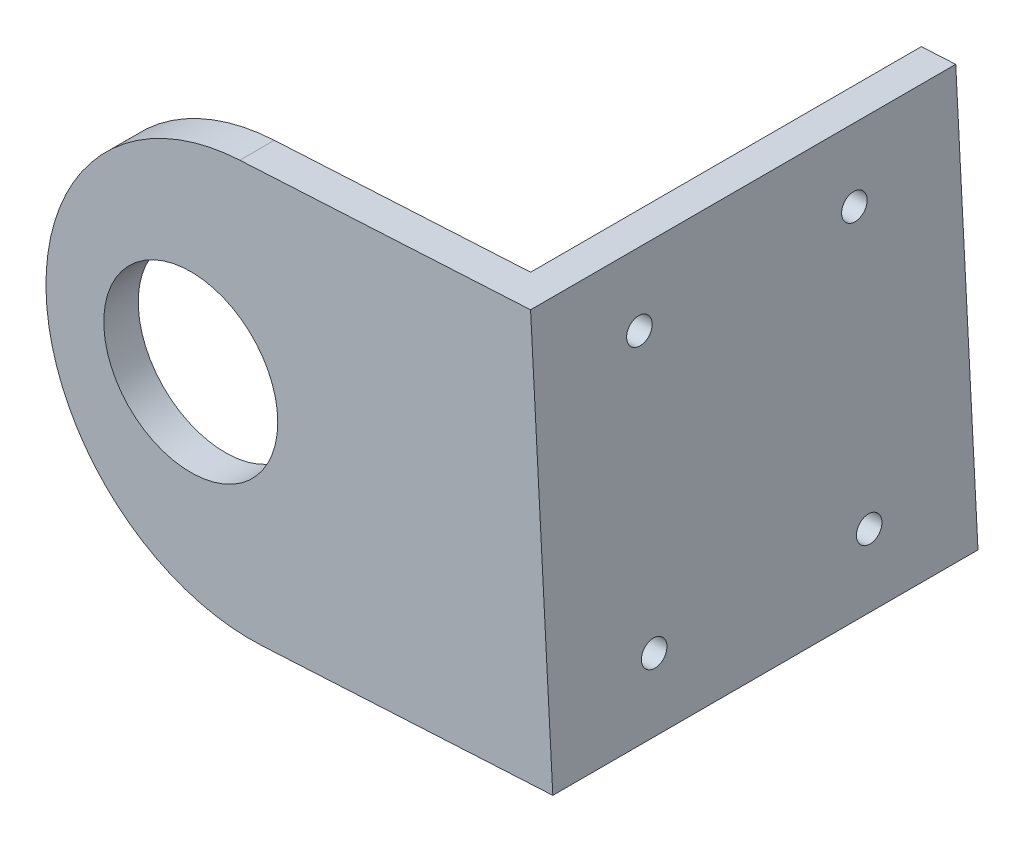
ISO-10303-21;
HEADER;
FILE_DESCRIPTION(('STEP AP214'),'2;1');
FILE_NAME('part.step','',(''),(''),'','','');
FILE_SCHEMA(('AUTOMOTIVE_DESIGN { 1 0 10303 214 1 1 1 1 }'));
ENDSEC;
DATA;
#1=APPLICATION_CONTEXT('core data for automotive mechanical design processes');
#2=APPLICATION_PROTOCOL_DEFINITION('international standard','automotive_design',2000,#1);
#3=PRODUCT_CONTEXT('',#1,'mechanical');
#4=PRODUCT('Part','Part','',(#3));
#5=PRODUCT_RELATED_PRODUCT_CATEGORY('part','',(#4));
#6=PRODUCT_DEFINITION_FORMATION('','',#4);
#7=PRODUCT_DEFINITION_CONTEXT('part definition',#1,'design');
#8=PRODUCT_DEFINITION('design','',#6,#7);
#9=PRODUCT_DEFINITION_SHAPE('','',#8);
#10=(LENGTH_UNIT() NAMED_UNIT(*) SI_UNIT(.MILLI.,.METRE.));
#11=(NAMED_UNIT(*) PLANE_ANGLE_UNIT() SI_UNIT($,.RADIAN.));
#12=(NAMED_UNIT(*) SI_UNIT($,.STERADIAN.) SOLID_ANGLE_UNIT());
#13=UNCERTAINTY_MEASURE_WITH_UNIT(LENGTH_MEASURE(1.E-05),#10,'distance_accuracy_value','');
#14=(GEOMETRIC_REPRESENTATION_CONTEXT(3) GLOBAL_UNCERTAINTY_ASSIGNED_CONTEXT((#13)) GLOBAL_UNIT_ASSIGNED_CONTEXT((#10,
#11,#12)) REPRESENTATION_CONTEXT('',''));
#15=CARTESIAN_POINT('',(0.,0.,0.));
#16=DIRECTION('',(0.,0.,1.));
#17=DIRECTION('',(1.,0.,0.));
#18=AXIS2_PLACEMENT_3D('',#15,#16,#17);
#19=CARTESIAN_POINT('',(8.73708907772197,0.475157287592046,0.));
#20=DIRECTION('',(0.,0.,-1.));
#21=DIRECTION('',(-1.,0.,0.));
#22=AXIS2_PLACEMENT_3D('',#19,#20,#21);
#23=CYLINDRICAL_SURFACE('',#22,29.75);
#24=DIRECTION('',(0.,0.,-1.));
#25=VECTOR('',#24,1.);
#26=CARTESIAN_POINT('',(7.12155429990905,30.1812601518467,5.));
#27=LINE('',#26,#25);
#28=CARTESIAN_POINT('',(7.12155429990905,30.1812601518467,0.));
#29=VERTEX_POINT('',#28);
#30=CARTESIAN_POINT('',(7.12155429990907,30.1812601518467,5.));
#31=VERTEX_POINT('',#30);
#32=EDGE_CURVE('E136',#29,#31,#27,.F.);
#33=ORIENTED_EDGE('',*,*,#32,.F.);
#34=CARTESIAN_POINT('',(8.73708907772197,0.475157287592046,0.));
#35=DIRECTION('',(0.,0.,-1.));
#36=DIRECTION('',(-1.,0.,0.));
#37=AXIS2_PLACEMENT_3D('',#34,#35,#36);
#38=CIRCLE('',#37,29.75);
#39=CARTESIAN_POINT('',(10.3526238555349,-29.2309455766626,0.));
#40=VERTEX_POINT('',#39);
#41=EDGE_CURVE('E43',#40,#29,#38,.T.);
#42=ORIENTED_EDGE('',*,*,#41,.F.);
#43=DIRECTION('',(0.,0.,-1.));
#44=VECTOR('',#43,1.);
#45=CARTESIAN_POINT('',(10.3526238555349,-29.2309455766626,5.));
#46=LINE('',#45,#44);
#47=CARTESIAN_POINT('',(10.3526238555349,-29.2309455766626,5.));
#48=VERTEX_POINT('',#47);
#49=EDGE_CURVE('E149',#48,#40,#46,.T.);
#50=ORIENTED_EDGE('',*,*,#49,.F.);
#51=CARTESIAN_POINT('',(8.73708907772197,0.475157287592046,5.));
#52=DIRECTION('',(0.,0.,-1.));
#53=DIRECTION('',(-1.,0.,0.));
#54=AXIS2_PLACEMENT_3D('',#51,#52,#53);
#55=CIRCLE('',#54,29.75);
#56=EDGE_CURVE('E11',#31,#48,#55,.F.);
#57=ORIENTED_EDGE('',*,*,#56,.F.);
#58=EDGE_LOOP('',(#33,#42,#50,#57));
#59=FACE_BOUND('',#58,.T.);
#60=ADVANCED_FACE('F35',(#59),#23,.T.);
#61=CARTESIAN_POINT('',(0.,0.,5.));
#62=DIRECTION('',(0.,0.,-1.));
#63=DIRECTION('',(-1.,0.,0.));
#64=AXIS2_PLACEMENT_3D('',#61,#62,#63);
#65=PLANE('',#64);
#66=DIRECTION('',(-0.998524466025366,-0.054303690010518,0.));
#67=VECTOR('',#66,1.);
#68=CARTESIAN_POINT('',(-22.5845485643456,28.5657253740338,5.));
#69=LINE('',#68,#67);
#70=CARTESIAN_POINT('',(49.3092129894808,32.4755910547911,5.));
#71=VERTEX_POINT('',#70);
#72=EDGE_CURVE('E91',#71,#31,#69,.T.);
#73=ORIENTED_EDGE('',*,*,#72,.T.);
#74=ORIENTED_EDGE('',*,*,#56,.T.);
#75=DIRECTION('',(0.998524466025366,0.0543036900105184,0.));
#76=VECTOR('',#75,1.);
#77=CARTESIAN_POINT('',(47.5476602149798,-27.2081331237708,5.));
#78=LINE('',#77,#76);
#79=CARTESIAN_POINT('',(52.5402825451066,-26.9366146737182,5.));
#80=VERTEX_POINT('',#79);
#81=EDGE_CURVE('E84',#48,#80,#78,.T.);
#82=ORIENTED_EDGE('',*,*,#81,.T.);
#83=DIRECTION('',(0.0543036900105177,-0.998524466025366,0.));
#84=VECTOR('',#83,1.);
#85=CARTESIAN_POINT('',(52.5402825451066,-26.9366146737182,5.));
#86=LINE('',#85,#84);
#87=EDGE_CURVE('E89',#71,#80,#86,.T.);
#88=ORIENTED_EDGE('',*,*,#87,.F.);
#89=EDGE_LOOP('',(#73,#74,#82,#88));
#90=FACE_BOUND('',#89,.T.);
#91=CARTESIAN_POINT('',(0.,0.,5.));
#92=DIRECTION('',(0.,0.,1.));
#93=DIRECTION('',(1.,0.,0.));
#94=AXIS2_PLACEMENT_3D('',#91,#92,#93);
#95=CIRCLE('',#94,12.625);
#96=CARTESIAN_POINT('',(12.625,0.,5.));
#97=VERTEX_POINT('',#96);
#98=EDGE_CURVE('E128',#97,#97,#95,.T.);
#99=ORIENTED_EDGE('',*,*,#98,.F.);
#100=EDGE_LOOP('',(#99));
#101=FACE_BOUND('',#100,.T.);
#102=ADVANCED_FACE('F86',(#90,#101),#65,.F.);
#103=CARTESIAN_POINT('',(0.,0.,0.));
#104=DIRECTION('',(0.,0.,-1.));
#105=DIRECTION('',(-1.,0.,0.));
#106=AXIS2_PLACEMENT_3D('',#103,#104,#105);
#107=PLANE('',#106);
#108=DIRECTION('',(0.998524466025366,0.0543036900105184,0.));
#109=VECTOR('',#108,1.);
#110=CARTESIAN_POINT('',(47.5476602149798,-27.2081331237708,0.));
#111=LINE('',#110,#109);
#112=CARTESIAN_POINT('',(47.5476602149798,-27.2081331237708,0.));
#113=VERTEX_POINT('',#112);
#114=EDGE_CURVE('E131',#40,#113,#111,.T.);
#115=ORIENTED_EDGE('',*,*,#114,.F.);
#116=ORIENTED_EDGE('',*,*,#41,.T.);
#117=DIRECTION('',(-0.998524466025366,-0.054303690010518,0.));
#118=VECTOR('',#117,1.);
#119=CARTESIAN_POINT('',(-22.5845485643456,28.5657253740338,0.));
#120=LINE('',#119,#118);
#121=CARTESIAN_POINT('',(44.3165906593539,32.2040726047385,0.));
#122=VERTEX_POINT('',#121);
#123=EDGE_CURVE('E92',#122,#29,#120,.T.);
#124=ORIENTED_EDGE('',*,*,#123,.F.);
#125=DIRECTION('',(-0.0543036900105177,0.998524466025366,0.));
#126=VECTOR('',#125,1.);
#127=CARTESIAN_POINT('',(44.3165906593539,32.2040726047385,0.));
#128=LINE('',#127,#126);
#129=EDGE_CURVE('E141',#113,#122,#128,.T.);
#130=ORIENTED_EDGE('',*,*,#129,.F.);
#131=EDGE_LOOP('',(#115,#116,#124,#130));
#132=FACE_BOUND('',#131,.T.);
#133=CARTESIAN_POINT('',(0.,0.,0.));
#134=DIRECTION('',(0.,0.,1.));
#135=DIRECTION('',(1.,0.,0.));
#136=AXIS2_PLACEMENT_3D('',#133,#134,#135);
#137=CIRCLE('',#136,12.625);
#138=CARTESIAN_POINT('',(12.625,0.,0.));
#139=VERTEX_POINT('',#138);
#140=EDGE_CURVE('E132',#139,#139,#137,.T.);
#141=ORIENTED_EDGE('',*,*,#140,.T.);
#142=EDGE_LOOP('',(#141));
#143=FACE_BOUND('',#142,.T.);
#144=ADVANCED_FACE('F152',(#132,#143),#107,.T.);
#145=CARTESIAN_POINT('',(47.5476602149798,-27.2081331237708,5.));
#146=DIRECTION('',(-0.0543036900105184,0.998524466025366,0.));
#147=DIRECTION('',(-0.998524466025366,-0.0543036900105184,0.));
#148=AXIS2_PLACEMENT_3D('',#145,#146,#147);
#149=PLANE('',#148);
#150=ORIENTED_EDGE('',*,*,#81,.F.);
#151=ORIENTED_EDGE('',*,*,#49,.T.);
#152=ORIENTED_EDGE('',*,*,#114,.T.);
#153=DIRECTION('',(0.,0.,-1.));
#154=VECTOR('',#153,1.);
#155=CARTESIAN_POINT('',(47.5476602149798,-27.2081331237708,-56.7));
#156=LINE('',#155,#154);
#157=CARTESIAN_POINT('',(47.5476602149798,-27.2081331237708,-56.7));
#158=VERTEX_POINT('',#157);
#159=EDGE_CURVE('E124',#113,#158,#156,.T.);
#160=ORIENTED_EDGE('',*,*,#159,.T.);
#161=DIRECTION('',(-0.998524466025366,-0.0543036900105177,0.));
#162=VECTOR('',#161,1.);
#163=CARTESIAN_POINT('',(52.5402825451066,-26.9366146737182,-56.7));
#164=LINE('',#163,#162);
#165=CARTESIAN_POINT('',(52.5402825451066,-26.9366146737182,-56.7));
#166=VERTEX_POINT('',#165);
#167=EDGE_CURVE('E98',#166,#158,#164,.T.);
#168=ORIENTED_EDGE('',*,*,#167,.F.);
#169=DIRECTION('',(0.,0.,-1.));
#170=VECTOR('',#169,1.);
#171=CARTESIAN_POINT('',(52.5402825451066,-26.9366146737182,-56.7));
#172=LINE('',#171,#170);
#173=EDGE_CURVE('E95',#80,#166,#172,.T.);
#174=ORIENTED_EDGE('',*,*,#173,.F.);
#175=EDGE_LOOP('',(#150,#151,#152,#160,#168,#174));
#176=FACE_BOUND('',#175,.T.);
#177=ADVANCED_FACE('F96',(#176),#149,.F.);
#178=CARTESIAN_POINT('',(-22.5845485643456,28.5657253740338,5.));
#179=DIRECTION('',(0.054303690010518,-0.998524466025366,0.));
#180=DIRECTION('',(0.998524466025366,0.054303690010518,0.));
#181=AXIS2_PLACEMENT_3D('',#178,#179,#180);
#182=PLANE('',#181);
#183=ORIENTED_EDGE('',*,*,#123,.T.);
#184=ORIENTED_EDGE('',*,*,#32,.T.);
#185=ORIENTED_EDGE('',*,*,#72,.F.);
#186=DIRECTION('',(0.,0.,1.));
#187=VECTOR('',#186,1.);
#188=CARTESIAN_POINT('',(49.3092129894808,32.4755910547911,5.));
#189=LINE('',#188,#187);
#190=CARTESIAN_POINT('',(49.3092129894808,32.4755910547911,-56.7));
#191=VERTEX_POINT('',#190);
#192=EDGE_CURVE('E107',#191,#71,#189,.T.);
#193=ORIENTED_EDGE('',*,*,#192,.F.);
#194=DIRECTION('',(-0.998524466025366,-0.0543036900105177,0.));
#195=VECTOR('',#194,1.);
#196=CARTESIAN_POINT('',(49.3092129894808,32.4755910547911,-56.7));
#197=LINE('',#196,#195);
#198=CARTESIAN_POINT('',(44.3165906593539,32.2040726047385,-56.7));
#199=VERTEX_POINT('',#198);
#200=EDGE_CURVE('E119',#191,#199,#197,.T.);
#201=ORIENTED_EDGE('',*,*,#200,.T.);
#202=DIRECTION('',(0.,0.,1.));
#203=VECTOR('',#202,1.);
#204=CARTESIAN_POINT('',(44.3165906593539,32.2040726047385,5.));
#205=LINE('',#204,#203);
#206=EDGE_CURVE('E108',#199,#122,#205,.T.);
#207=ORIENTED_EDGE('',*,*,#206,.T.);
#208=EDGE_LOOP('',(#183,#184,#185,#193,#201,#207));
#209=FACE_BOUND('',#208,.T.);
#210=ADVANCED_FACE('F158',(#209),#182,.F.);
#211=CARTESIAN_POINT('',(0.,0.,5.));
#212=DIRECTION('',(0.,0.,-1.));
#213=DIRECTION('',(-1.,0.,0.));
#214=AXIS2_PLACEMENT_3D('',#211,#212,#213);
#215=CYLINDRICAL_SURFACE('',#214,12.625);
#216=ORIENTED_EDGE('',*,*,#98,.T.);
#217=EDGE_LOOP('',(#216));
#218=FACE_BOUND('',#217,.T.);
#219=ORIENTED_EDGE('',*,*,#140,.F.);
#220=EDGE_LOOP('',(#219));
#221=FACE_BOUND('',#220,.T.);
#222=ADVANCED_FACE('F193',(#218,#221),#215,.F.);
#223=CARTESIAN_POINT('',(50.9247477672937,2.76948819053641,0.));
#224=DIRECTION('',(-0.998524466025366,-0.0543036900105177,0.));
#225=DIRECTION('',(0.0543036900105177,-0.998524466025366,0.));
#226=AXIS2_PLACEMENT_3D('',#223,#224,#225);
#227=PLANE('',#226);
#228=ORIENTED_EDGE('',*,*,#87,.T.);
#229=ORIENTED_EDGE('',*,*,#173,.T.);
#230=DIRECTION('',(-0.0543036900105177,0.998524466025366,0.));
#231=VECTOR('',#230,1.);
#232=CARTESIAN_POINT('',(49.3092129894808,32.4755910547911,-56.7));
#233=LINE('',#232,#231);
#234=EDGE_CURVE('E101',#166,#191,#233,.T.);
#235=ORIENTED_EDGE('',*,*,#234,.T.);
#236=ORIENTED_EDGE('',*,*,#192,.T.);
#237=EDGE_LOOP('',(#228,#229,#235,#236));
#238=FACE_BOUND('',#237,.T.);
#239=CARTESIAN_POINT('',(49.852249889586,22.4903463945374,-10.25));
#240=DIRECTION('',(0.998524466025366,0.0543036900105177,0.));
#241=DIRECTION('',(-0.0543036900105177,0.998524466025366,0.));
#242=AXIS2_PLACEMENT_3D('',#239,#240,#241);
#243=CIRCLE('',#242,1.85);
#244=CARTESIAN_POINT('',(49.7517880630665,24.3376166566843,-10.25));
#245=VERTEX_POINT('',#244);
#246=EDGE_CURVE('E126',#245,#245,#243,.T.);
#247=ORIENTED_EDGE('',*,*,#246,.F.);
#248=EDGE_LOOP('',(#247));
#249=FACE_BOUND('',#248,.T.);
#250=CARTESIAN_POINT('',(49.852249889586,22.4903463945374,-41.45));
#251=DIRECTION('',(0.998524466025366,0.0543036900105177,0.));
#252=DIRECTION('',(-0.0543036900105177,0.998524466025366,0.));
#253=AXIS2_PLACEMENT_3D('',#250,#251,#252);
#254=CIRCLE('',#253,1.85);
#255=CARTESIAN_POINT('',(49.7517880630665,24.3376166566843,-41.45));
#256=VERTEX_POINT('',#255);
#257=EDGE_CURVE('E311',#256,#256,#254,.T.);
#258=ORIENTED_EDGE('',*,*,#257,.F.);
#259=EDGE_LOOP('',(#258));
#260=FACE_BOUND('',#259,.T.);
#261=CARTESIAN_POINT('',(51.9972456450014,-16.9513700134646,-41.45));
#262=DIRECTION('',(0.998524466025366,0.0543036900105177,0.));
#263=DIRECTION('',(-0.0543036900105177,0.998524466025366,0.));
#264=AXIS2_PLACEMENT_3D('',#261,#262,#263);
#265=CIRCLE('',#264,1.85);
#266=CARTESIAN_POINT('',(51.8967838184819,-15.1040997513176,-41.45));
#267=VERTEX_POINT('',#266);
#268=EDGE_CURVE('E305',#267,#267,#265,.T.);
#269=ORIENTED_EDGE('',*,*,#268,.F.);
#270=EDGE_LOOP('',(#269));
#271=FACE_BOUND('',#270,.T.);
#272=CARTESIAN_POINT('',(51.9972456450014,-16.9513700134646,-10.25));
#273=DIRECTION('',(0.998524466025366,0.0543036900105177,0.));
#274=DIRECTION('',(-0.0543036900105177,0.998524466025366,0.));
#275=AXIS2_PLACEMENT_3D('',#272,#273,#274);
#276=CIRCLE('',#275,1.85);
#277=CARTESIAN_POINT('',(51.8967838184819,-15.1040997513176,-10.25));
#278=VERTEX_POINT('',#277);
#279=EDGE_CURVE('E296',#278,#278,#276,.T.);
#280=ORIENTED_EDGE('',*,*,#279,.F.);
#281=EDGE_LOOP('',(#280));
#282=FACE_BOUND('',#281,.T.);
#283=ADVANCED_FACE('F104',(#238,#249,#260,#271,#282),#227,.F.);
#284=CARTESIAN_POINT('',(45.9321254371669,2.49796974048382,0.));
#285=DIRECTION('',(-0.998524466025366,-0.0543036900105177,0.));
#286=DIRECTION('',(0.0543036900105177,-0.998524466025366,0.));
#287=AXIS2_PLACEMENT_3D('',#284,#285,#286);
#288=PLANE('',#287);
#289=CARTESIAN_POINT('',(47.0046233148746,-17.2228884635172,-41.45));
#290=DIRECTION('',(0.998524466025366,0.0543036900105177,0.));
#291=DIRECTION('',(-0.0543036900105177,0.998524466025366,0.));
#292=AXIS2_PLACEMENT_3D('',#289,#290,#291);
#293=CIRCLE('',#292,1.85);
#294=CARTESIAN_POINT('',(46.9041614883551,-15.3756182013702,-41.45));
#295=VERTEX_POINT('',#294);
#296=EDGE_CURVE('E302',#295,#295,#293,.T.);
#297=ORIENTED_EDGE('',*,*,#296,.T.);
#298=EDGE_LOOP('',(#297));
#299=FACE_BOUND('',#298,.T.);
#300=CARTESIAN_POINT('',(44.8596275594591,22.2188279444848,-10.25));
#301=DIRECTION('',(0.998524466025366,0.0543036900105177,0.));
#302=DIRECTION('',(-0.0543036900105177,0.998524466025366,0.));
#303=AXIS2_PLACEMENT_3D('',#300,#301,#302);
#304=CIRCLE('',#303,1.85);
#305=CARTESIAN_POINT('',(44.7591657329397,24.0660982066317,-10.25));
#306=VERTEX_POINT('',#305);
#307=EDGE_CURVE('E114',#306,#306,#304,.T.);
#308=ORIENTED_EDGE('',*,*,#307,.T.);
#309=EDGE_LOOP('',(#308));
#310=FACE_BOUND('',#309,.T.);
#311=ORIENTED_EDGE('',*,*,#159,.F.);
#312=ORIENTED_EDGE('',*,*,#129,.T.);
#313=ORIENTED_EDGE('',*,*,#206,.F.);
#314=DIRECTION('',(-0.0543036900105177,0.998524466025366,0.));
#315=VECTOR('',#314,1.);
#316=CARTESIAN_POINT('',(44.3165906593539,32.2040726047385,-56.7));
#317=LINE('',#316,#315);
#318=EDGE_CURVE('E111',#158,#199,#317,.T.);
#319=ORIENTED_EDGE('',*,*,#318,.F.);
#320=EDGE_LOOP('',(#311,#312,#313,#319));
#321=FACE_BOUND('',#320,.T.);
#322=CARTESIAN_POINT('',(44.8596275594591,22.2188279444848,-41.45));
#323=DIRECTION('',(0.998524466025366,0.0543036900105177,0.));
#324=DIRECTION('',(-0.0543036900105177,0.998524466025366,0.));
#325=AXIS2_PLACEMENT_3D('',#322,#323,#324);
#326=CIRCLE('',#325,1.85);
#327=CARTESIAN_POINT('',(44.7591657329397,24.0660982066317,-41.45));
#328=VERTEX_POINT('',#327);
#329=EDGE_CURVE('E308',#328,#328,#326,.T.);
#330=ORIENTED_EDGE('',*,*,#329,.T.);
#331=EDGE_LOOP('',(#330));
#332=FACE_BOUND('',#331,.T.);
#333=CARTESIAN_POINT('',(47.0046233148746,-17.2228884635172,-10.25));
#334=DIRECTION('',(0.998524466025366,0.0543036900105177,0.));
#335=DIRECTION('',(-0.0543036900105177,0.998524466025366,0.));
#336=AXIS2_PLACEMENT_3D('',#333,#334,#335);
#337=CIRCLE('',#336,1.85);
#338=CARTESIAN_POINT('',(46.9041614883551,-15.3756182013702,-10.25));
#339=VERTEX_POINT('',#338);
#340=EDGE_CURVE('E299',#339,#339,#337,.T.);
#341=ORIENTED_EDGE('',*,*,#340,.T.);
#342=EDGE_LOOP('',(#341));
#343=FACE_BOUND('',#342,.T.);
#344=ADVANCED_FACE('F165',(#299,#310,#321,#332,#343),#288,.T.);
#345=CARTESIAN_POINT('',(49.3092129894808,32.4755910547911,-56.7));
#346=DIRECTION('',(0.,0.,1.));
#347=DIRECTION('',(1.,0.,0.));
#348=AXIS2_PLACEMENT_3D('',#345,#346,#347);
#349=PLANE('',#348);
#350=ORIENTED_EDGE('',*,*,#318,.T.);
#351=ORIENTED_EDGE('',*,*,#200,.F.);
#352=ORIENTED_EDGE('',*,*,#234,.F.);
#353=ORIENTED_EDGE('',*,*,#167,.T.);
#354=EDGE_LOOP('',(#350,#351,#352,#353));
#355=FACE_BOUND('',#354,.T.);
#356=ADVANCED_FACE('F168',(#355),#349,.F.);
#357=CARTESIAN_POINT('',(49.852249889586,22.4903463945374,-10.25));
#358=DIRECTION('',(-0.998524466025366,-0.0543036900105177,0.));
#359=DIRECTION('',(0.0543036900105177,-0.998524466025366,0.));
#360=AXIS2_PLACEMENT_3D('',#357,#358,#359);
#361=CYLINDRICAL_SURFACE('',#360,1.85);
#362=ORIENTED_EDGE('',*,*,#246,.T.);
#363=EDGE_LOOP('',(#362));
#364=FACE_BOUND('',#363,.T.);
#365=ORIENTED_EDGE('',*,*,#307,.F.);
#366=EDGE_LOOP('',(#365));
#367=FACE_BOUND('',#366,.T.);
#368=ADVANCED_FACE('F172',(#364,#367),#361,.F.);
#369=CARTESIAN_POINT('',(49.852249889586,22.4903463945374,-41.45));
#370=DIRECTION('',(-0.998524466025366,-0.0543036900105177,0.));
#371=DIRECTION('',(0.0543036900105177,-0.998524466025366,0.));
#372=AXIS2_PLACEMENT_3D('',#369,#370,#371);
#373=CYLINDRICAL_SURFACE('',#372,1.85);
#374=ORIENTED_EDGE('',*,*,#257,.T.);
#375=EDGE_LOOP('',(#374));
#376=FACE_BOUND('',#375,.T.);
#377=ORIENTED_EDGE('',*,*,#329,.F.);
#378=EDGE_LOOP('',(#377));
#379=FACE_BOUND('',#378,.T.);
#380=ADVANCED_FACE('F178',(#376,#379),#373,.F.);
#381=CARTESIAN_POINT('',(51.9972456450014,-16.9513700134646,-41.45));
#382=DIRECTION('',(-0.998524466025366,-0.0543036900105177,0.));
#383=DIRECTION('',(0.0543036900105177,-0.998524466025366,0.));
#384=AXIS2_PLACEMENT_3D('',#381,#382,#383);
#385=CYLINDRICAL_SURFACE('',#384,1.85);
#386=ORIENTED_EDGE('',*,*,#268,.T.);
#387=EDGE_LOOP('',(#386));
#388=FACE_BOUND('',#387,.T.);
#389=ORIENTED_EDGE('',*,*,#296,.F.);
#390=EDGE_LOOP('',(#389));
#391=FACE_BOUND('',#390,.T.);
#392=ADVANCED_FACE('F240',(#388,#391),#385,.F.);
#393=CARTESIAN_POINT('',(51.9972456450014,-16.9513700134646,-10.25));
#394=DIRECTION('',(-0.998524466025366,-0.0543036900105177,0.));
#395=DIRECTION('',(0.0543036900105177,-0.998524466025366,0.));
#396=AXIS2_PLACEMENT_3D('',#393,#394,#395);
#397=CYLINDRICAL_SURFACE('',#396,1.85);
#398=ORIENTED_EDGE('',*,*,#279,.T.);
#399=EDGE_LOOP('',(#398));
#400=FACE_BOUND('',#399,.T.);
#401=ORIENTED_EDGE('',*,*,#340,.F.);
#402=EDGE_LOOP('',(#401));
#403=FACE_BOUND('',#402,.T.);
#404=ADVANCED_FACE('F250',(#400,#403),#397,.F.);
#405=CLOSED_SHELL('',(#60,#102,#144,#177,#210,#222,#283,#344,#356,#368,#380,#392,#404));
#406=MANIFOLD_SOLID_BREP('B2',#405);
#407=ADVANCED_BREP_SHAPE_REPRESENTATION('',(#18,#406),#14);
#408=SHAPE_DEFINITION_REPRESENTATION(#9,#407);
ENDSEC;
END-ISO-10303-21;
